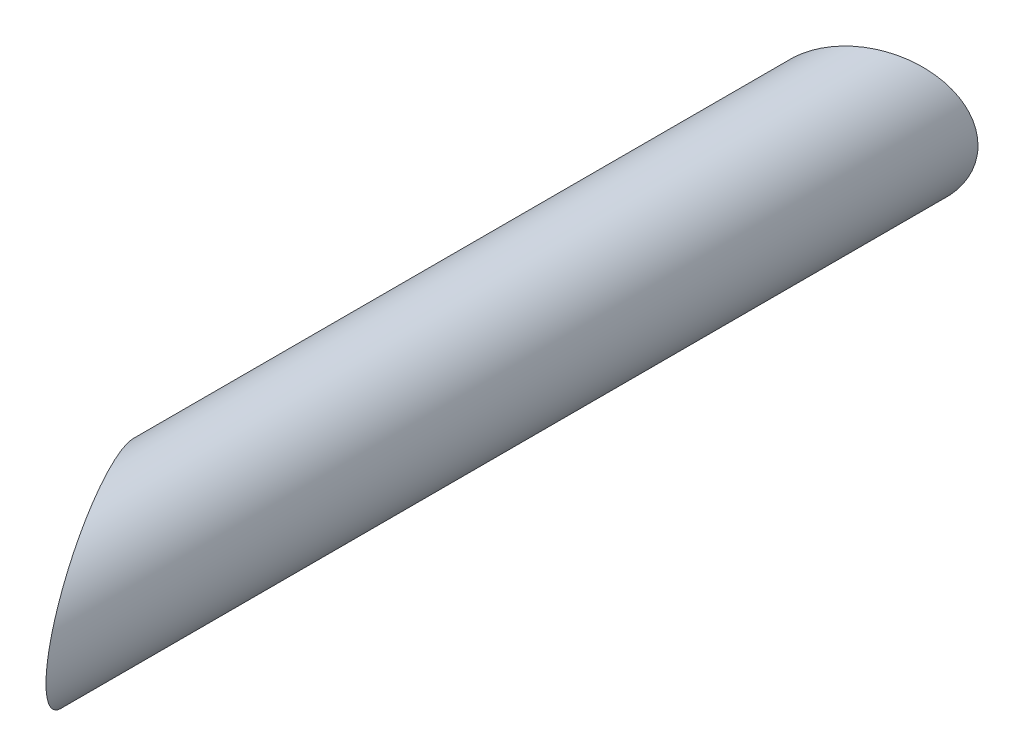
ISO-10303-21;
HEADER;
FILE_DESCRIPTION(('STEP AP214'),'2;1');
FILE_NAME('part.step','',(''),(''),'','','');
FILE_SCHEMA(('AUTOMOTIVE_DESIGN { 1 0 10303 214 1 1 1 1 }'));
ENDSEC;
DATA;
#1=APPLICATION_CONTEXT('core data for automotive mechanical design processes');
#2=APPLICATION_PROTOCOL_DEFINITION('international standard','automotive_design',2000,#1);
#3=PRODUCT_CONTEXT('',#1,'mechanical');
#4=PRODUCT('Part','Part','',(#3));
#5=PRODUCT_RELATED_PRODUCT_CATEGORY('part','',(#4));
#6=PRODUCT_DEFINITION_FORMATION('','',#4);
#7=PRODUCT_DEFINITION_CONTEXT('part definition',#1,'design');
#8=PRODUCT_DEFINITION('design','',#6,#7);
#9=PRODUCT_DEFINITION_SHAPE('','',#8);
#10=(LENGTH_UNIT() NAMED_UNIT(*) SI_UNIT(.MILLI.,.METRE.));
#11=(NAMED_UNIT(*) PLANE_ANGLE_UNIT() SI_UNIT($,.RADIAN.));
#12=(NAMED_UNIT(*) SI_UNIT($,.STERADIAN.) SOLID_ANGLE_UNIT());
#13=UNCERTAINTY_MEASURE_WITH_UNIT(LENGTH_MEASURE(1.E-05),#10,'distance_accuracy_value','');
#14=(GEOMETRIC_REPRESENTATION_CONTEXT(3) GLOBAL_UNCERTAINTY_ASSIGNED_CONTEXT((#13)) GLOBAL_UNIT_ASSIGNED_CONTEXT((#10,
#11,#12)) REPRESENTATION_CONTEXT('',''));
#15=CARTESIAN_POINT('',(0.,0.,0.));
#16=DIRECTION('',(0.,0.,1.));
#17=DIRECTION('',(1.,0.,0.));
#18=AXIS2_PLACEMENT_3D('',#15,#16,#17);
#19=CARTESIAN_POINT('',(0.,0.,100.));
#20=DIRECTION('',(0.,0.,-1.));
#21=DIRECTION('',(-1.,0.,0.));
#22=AXIS2_PLACEMENT_3D('',#19,#20,#21);
#23=CYLINDRICAL_SURFACE('',#22,7.5);
#24=CARTESIAN_POINT('',(0.,0.,4.3301270189222));
#25=DIRECTION('',(0.500000000000001,0.,0.866025403784438));
#26=DIRECTION('',(0.866025403784438,0.,-0.500000000000001));
#27=AXIS2_PLACEMENT_3D('',#24,#25,#26);
#28=ELLIPSE('',#27,8.66025403784439,7.5);
#29=CARTESIAN_POINT('',(7.5,0.,0.));
#30=VERTEX_POINT('',#29);
#31=EDGE_CURVE('E37',#30,#30,#28,.T.);
#32=ORIENTED_EDGE('',*,*,#31,.T.);
#33=EDGE_LOOP('',(#32));
#34=FACE_BOUND('',#33,.T.);
#35=CARTESIAN_POINT('',(0.,0.,87.0096189432336));
#36=DIRECTION('',(0.866025403784436,0.,-0.500000000000004));
#37=DIRECTION('',(-0.500000000000004,0.,-0.866025403784436));
#38=AXIS2_PLACEMENT_3D('',#35,#36,#37);
#39=ELLIPSE('',#38,14.9999999999999,7.5);
#40=CARTESIAN_POINT('',(-7.5,0.,74.0192378864671));
#41=VERTEX_POINT('',#40);
#42=EDGE_CURVE('E10',#41,#41,#39,.T.);
#43=ORIENTED_EDGE('',*,*,#42,.T.);
#44=EDGE_LOOP('',(#43));
#45=FACE_BOUND('',#44,.T.);
#46=ADVANCED_FACE('F31',(#34,#45),#23,.T.);
#47=CARTESIAN_POINT('',(7.5,-50.,100.));
#48=DIRECTION('',(0.866025403784436,0.,-0.500000000000004));
#49=DIRECTION('',(-0.500000000000004,0.,-0.866025403784436));
#50=AXIS2_PLACEMENT_3D('',#47,#48,#49);
#51=PLANE('',#50);
#52=CARTESIAN_POINT('',(-3.49999999999997,0.,80.9474411167426));
#53=DIRECTION('',(-0.866025403784436,0.,0.500000000000004));
#54=DIRECTION('',(0.500000000000004,0.,0.866025403784436));
#55=AXIS2_PLACEMENT_3D('',#52,#53,#54);
#56=CIRCLE('',#55,2.5);
#57=CARTESIAN_POINT('',(-2.24999999999996,0.,83.1125046262037));
#58=VERTEX_POINT('',#57);
#59=EDGE_CURVE('E51',#58,#58,#56,.T.);
#60=ORIENTED_EDGE('',*,*,#59,.F.);
#61=EDGE_LOOP('',(#60));
#62=FACE_BOUND('',#61,.T.);
#63=ORIENTED_EDGE('',*,*,#42,.F.);
#64=EDGE_LOOP('',(#63));
#65=FACE_BOUND('',#64,.T.);
#66=ADVANCED_FACE('F66',(#62,#65),#51,.F.);
#67=CARTESIAN_POINT('',(7.5,-50.,0.));
#68=DIRECTION('',(0.500000000000001,0.,0.866025403784438));
#69=DIRECTION('',(0.866025403784438,0.,-0.500000000000001));
#70=AXIS2_PLACEMENT_3D('',#67,#68,#69);
#71=PLANE('',#70);
#72=CARTESIAN_POINT('',(-2.30384757729337,0.,5.66025403784441));
#73=DIRECTION('',(-0.500000000000001,0.,-0.866025403784438));
#74=DIRECTION('',(-0.866025403784438,0.,0.500000000000001));
#75=AXIS2_PLACEMENT_3D('',#72,#73,#74);
#76=CIRCLE('',#75,2.5);
#77=CARTESIAN_POINT('',(-4.46891108675446,0.,6.91025403784441));
#78=VERTEX_POINT('',#77);
#79=EDGE_CURVE('E45',#78,#78,#76,.T.);
#80=ORIENTED_EDGE('',*,*,#79,.F.);
#81=EDGE_LOOP('',(#80));
#82=FACE_BOUND('',#81,.T.);
#83=ORIENTED_EDGE('',*,*,#31,.F.);
#84=EDGE_LOOP('',(#83));
#85=FACE_BOUND('',#84,.T.);
#86=ADVANCED_FACE('F69',(#82,#85),#71,.F.);
#87=CARTESIAN_POINT('',(2.69615242270664,0.,14.3205080756888));
#88=DIRECTION('',(-0.500000000000001,0.,-0.866025403784438));
#89=DIRECTION('',(-0.866025403784438,0.,0.500000000000001));
#90=AXIS2_PLACEMENT_3D('',#87,#88,#89);
#91=CYLINDRICAL_SURFACE('',#90,2.5);
#92=CARTESIAN_POINT('',(2.69615242270664,0.,14.3205080756888));
#93=DIRECTION('',(-0.500000000000001,0.,-0.866025403784438));
#94=DIRECTION('',(-0.866025403784438,0.,0.500000000000001));
#95=AXIS2_PLACEMENT_3D('',#92,#93,#94);
#96=CIRCLE('',#95,2.5);
#97=CARTESIAN_POINT('',(0.53108891324555,0.,15.5705080756888));
#98=VERTEX_POINT('',#97);
#99=EDGE_CURVE('E41',#98,#98,#96,.T.);
#100=ORIENTED_EDGE('',*,*,#99,.F.);
#101=EDGE_LOOP('',(#100));
#102=FACE_BOUND('',#101,.T.);
#103=ORIENTED_EDGE('',*,*,#79,.T.);
#104=EDGE_LOOP('',(#103));
#105=FACE_BOUND('',#104,.T.);
#106=ADVANCED_FACE('F74',(#102,#105),#91,.F.);
#107=CARTESIAN_POINT('',(2.69615242270664,0.,14.3205080756888));
#108=DIRECTION('',(-0.500000000000001,0.,-0.866025403784438));
#109=DIRECTION('',(-0.866025403784438,0.,0.500000000000001));
#110=AXIS2_PLACEMENT_3D('',#107,#108,#109);
#111=PLANE('',#110);
#112=ORIENTED_EDGE('',*,*,#99,.T.);
#113=EDGE_LOOP('',(#112));
#114=FACE_BOUND('',#113,.T.);
#115=ADVANCED_FACE('F62',(#114),#111,.T.);
#116=CARTESIAN_POINT('',(2.56217782649109,0.,77.4474411167426));
#117=DIRECTION('',(-0.866025403784436,0.,0.500000000000004));
#118=DIRECTION('',(0.500000000000004,0.,0.866025403784436));
#119=AXIS2_PLACEMENT_3D('',#116,#117,#118);
#120=CYLINDRICAL_SURFACE('',#119,2.5);
#121=CARTESIAN_POINT('',(2.56217782649109,0.,77.4474411167426));
#122=DIRECTION('',(-0.866025403784436,0.,0.500000000000004));
#123=DIRECTION('',(0.500000000000004,0.,0.866025403784436));
#124=AXIS2_PLACEMENT_3D('',#121,#122,#123);
#125=CIRCLE('',#124,2.5);
#126=CARTESIAN_POINT('',(3.8121778264911,0.,79.6125046262037));
#127=VERTEX_POINT('',#126);
#128=EDGE_CURVE('E49',#127,#127,#125,.T.);
#129=ORIENTED_EDGE('',*,*,#128,.F.);
#130=EDGE_LOOP('',(#129));
#131=FACE_BOUND('',#130,.T.);
#132=ORIENTED_EDGE('',*,*,#59,.T.);
#133=EDGE_LOOP('',(#132));
#134=FACE_BOUND('',#133,.T.);
#135=ADVANCED_FACE('F59',(#131,#134),#120,.F.);
#136=CARTESIAN_POINT('',(2.56217782649109,0.,77.4474411167426));
#137=DIRECTION('',(-0.866025403784436,0.,0.500000000000004));
#138=DIRECTION('',(0.500000000000004,0.,0.866025403784436));
#139=AXIS2_PLACEMENT_3D('',#136,#137,#138);
#140=PLANE('',#139);
#141=ORIENTED_EDGE('',*,*,#128,.T.);
#142=EDGE_LOOP('',(#141));
#143=FACE_BOUND('',#142,.T.);
#144=ADVANCED_FACE('F57',(#143),#140,.T.);
#145=CLOSED_SHELL('',(#46,#66,#86,#106,#115,#135,#144));
#146=MANIFOLD_SOLID_BREP('B2',#145);
#147=ADVANCED_BREP_SHAPE_REPRESENTATION('',(#18,#146),#14);
#148=SHAPE_DEFINITION_REPRESENTATION(#9,#147);
ENDSEC;
END-ISO-10303-21;
